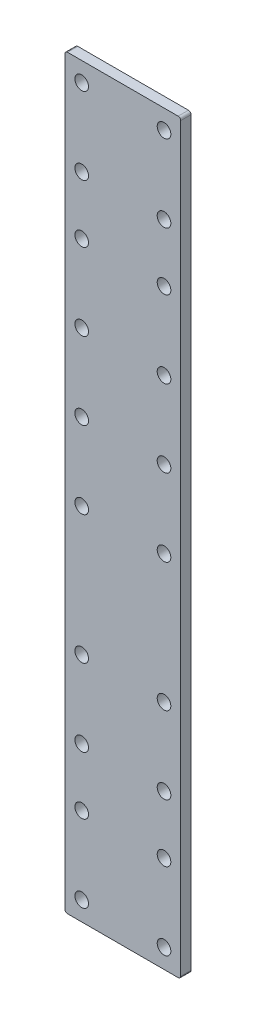
ISO-10303-21;
HEADER;
FILE_DESCRIPTION(('STEP AP214'),'2;1');
FILE_NAME('part.step','',(''),(''),'','','');
FILE_SCHEMA(('AUTOMOTIVE_DESIGN { 1 0 10303 214 1 1 1 1 }'));
ENDSEC;
DATA;
#1=APPLICATION_CONTEXT('core data for automotive mechanical design processes');
#2=APPLICATION_PROTOCOL_DEFINITION('international standard','automotive_design',2000,#1);
#3=PRODUCT_CONTEXT('',#1,'mechanical');
#4=PRODUCT('Part','Part','',(#3));
#5=PRODUCT_RELATED_PRODUCT_CATEGORY('part','',(#4));
#6=PRODUCT_DEFINITION_FORMATION('','',#4);
#7=PRODUCT_DEFINITION_CONTEXT('part definition',#1,'design');
#8=PRODUCT_DEFINITION('design','',#6,#7);
#9=PRODUCT_DEFINITION_SHAPE('','',#8);
#10=(LENGTH_UNIT() NAMED_UNIT(*) SI_UNIT(.MILLI.,.METRE.));
#11=(NAMED_UNIT(*) PLANE_ANGLE_UNIT() SI_UNIT($,.RADIAN.));
#12=(NAMED_UNIT(*) SI_UNIT($,.STERADIAN.) SOLID_ANGLE_UNIT());
#13=UNCERTAINTY_MEASURE_WITH_UNIT(LENGTH_MEASURE(1.E-05),#10,'distance_accuracy_value','');
#14=(GEOMETRIC_REPRESENTATION_CONTEXT(3) GLOBAL_UNCERTAINTY_ASSIGNED_CONTEXT((#13)) GLOBAL_UNIT_ASSIGNED_CONTEXT((#10,
#11,#12)) REPRESENTATION_CONTEXT('',''));
#15=CARTESIAN_POINT('',(0.,0.,0.));
#16=DIRECTION('',(0.,0.,1.));
#17=DIRECTION('',(1.,0.,0.));
#18=AXIS2_PLACEMENT_3D('',#15,#16,#17);
#19=CARTESIAN_POINT('',(-22.5,150.,4.));
#20=DIRECTION('',(1.,0.,0.));
#21=DIRECTION('',(0.,0.,-1.));
#22=AXIS2_PLACEMENT_3D('',#19,#20,#21);
#23=PLANE('',#22);
#24=DIRECTION('',(0.,-1.,0.));
#25=VECTOR('',#24,1.);
#26=CARTESIAN_POINT('',(-22.5,150.,0.));
#27=LINE('',#26,#25);
#28=CARTESIAN_POINT('',(-22.5,149.,0.));
#29=VERTEX_POINT('',#28);
#30=CARTESIAN_POINT('',(-22.5,-139.,0.));
#31=VERTEX_POINT('',#30);
#32=EDGE_CURVE('E126',#29,#31,#27,.T.);
#33=ORIENTED_EDGE('',*,*,#32,.T.);
#34=DIRECTION('',(0.,0.,-1.));
#35=VECTOR('',#34,1.);
#36=CARTESIAN_POINT('',(-22.5,-139.,4.));
#37=LINE('',#36,#35);
#38=CARTESIAN_POINT('',(-22.5,-139.,4.));
#39=VERTEX_POINT('',#38);
#40=EDGE_CURVE('E104',#31,#39,#37,.F.);
#41=ORIENTED_EDGE('',*,*,#40,.T.);
#42=DIRECTION('',(0.,-1.,0.));
#43=VECTOR('',#42,1.);
#44=CARTESIAN_POINT('',(-22.5,150.,4.));
#45=LINE('',#44,#43);
#46=CARTESIAN_POINT('',(-22.5,149.,4.));
#47=VERTEX_POINT('',#46);
#48=EDGE_CURVE('E136',#47,#39,#45,.T.);
#49=ORIENTED_EDGE('',*,*,#48,.F.);
#50=DIRECTION('',(0.,0.,-1.));
#51=VECTOR('',#50,1.);
#52=CARTESIAN_POINT('',(-22.5,149.,4.));
#53=LINE('',#52,#51);
#54=EDGE_CURVE('E109',#47,#29,#53,.T.);
#55=ORIENTED_EDGE('',*,*,#54,.T.);
#56=EDGE_LOOP('',(#33,#41,#49,#55));
#57=FACE_BOUND('',#56,.T.);
#58=ADVANCED_FACE('F33',(#57),#23,.F.);
#59=CARTESIAN_POINT('',(-22.5,-140.,4.));
#60=DIRECTION('',(0.,1.,0.));
#61=DIRECTION('',(0.,0.,1.));
#62=AXIS2_PLACEMENT_3D('',#59,#60,#61);
#63=PLANE('',#62);
#64=DIRECTION('',(1.,0.,0.));
#65=VECTOR('',#64,1.);
#66=CARTESIAN_POINT('',(-22.5,-140.,4.));
#67=LINE('',#66,#65);
#68=CARTESIAN_POINT('',(-21.5,-140.,4.));
#69=VERTEX_POINT('',#68);
#70=CARTESIAN_POINT('',(21.5,-140.,4.));
#71=VERTEX_POINT('',#70);
#72=EDGE_CURVE('E119',#69,#71,#67,.T.);
#73=ORIENTED_EDGE('',*,*,#72,.F.);
#74=DIRECTION('',(0.,0.,-1.));
#75=VECTOR('',#74,1.);
#76=CARTESIAN_POINT('',(-21.5,-140.,4.));
#77=LINE('',#76,#75);
#78=CARTESIAN_POINT('',(-21.5,-140.,0.));
#79=VERTEX_POINT('',#78);
#80=EDGE_CURVE('E103',#69,#79,#77,.T.);
#81=ORIENTED_EDGE('',*,*,#80,.T.);
#82=DIRECTION('',(1.,0.,0.));
#83=VECTOR('',#82,1.);
#84=CARTESIAN_POINT('',(-22.5,-140.,0.));
#85=LINE('',#84,#83);
#86=CARTESIAN_POINT('',(21.5,-140.,0.));
#87=VERTEX_POINT('',#86);
#88=EDGE_CURVE('E116',#79,#87,#85,.T.);
#89=ORIENTED_EDGE('',*,*,#88,.T.);
#90=DIRECTION('',(0.,0.,-1.));
#91=VECTOR('',#90,1.);
#92=CARTESIAN_POINT('',(21.5,-140.,4.));
#93=LINE('',#92,#91);
#94=EDGE_CURVE('E121',#87,#71,#93,.F.);
#95=ORIENTED_EDGE('',*,*,#94,.T.);
#96=EDGE_LOOP('',(#73,#81,#89,#95));
#97=FACE_BOUND('',#96,.T.);
#98=ADVANCED_FACE('F115',(#97),#63,.F.);
#99=CARTESIAN_POINT('',(22.5,150.,4.));
#100=DIRECTION('',(-1.,0.,0.));
#101=DIRECTION('',(0.,0.,1.));
#102=AXIS2_PLACEMENT_3D('',#99,#100,#101);
#103=PLANE('',#102);
#104=DIRECTION('',(0.,1.,0.));
#105=VECTOR('',#104,1.);
#106=CARTESIAN_POINT('',(22.5,150.,4.));
#107=LINE('',#106,#105);
#108=CARTESIAN_POINT('',(22.5,-139.,4.));
#109=VERTEX_POINT('',#108);
#110=CARTESIAN_POINT('',(22.5,149.,4.));
#111=VERTEX_POINT('',#110);
#112=EDGE_CURVE('E162',#109,#111,#107,.T.);
#113=ORIENTED_EDGE('',*,*,#112,.F.);
#114=DIRECTION('',(0.,0.,-1.));
#115=VECTOR('',#114,1.);
#116=CARTESIAN_POINT('',(22.5,-139.,4.));
#117=LINE('',#116,#115);
#118=CARTESIAN_POINT('',(22.5,-139.,0.));
#119=VERTEX_POINT('',#118);
#120=EDGE_CURVE('E155',#109,#119,#117,.T.);
#121=ORIENTED_EDGE('',*,*,#120,.T.);
#122=DIRECTION('',(0.,1.,0.));
#123=VECTOR('',#122,1.);
#124=CARTESIAN_POINT('',(22.5,150.,0.));
#125=LINE('',#124,#123);
#126=CARTESIAN_POINT('',(22.5,149.,0.));
#127=VERTEX_POINT('',#126);
#128=EDGE_CURVE('E125',#119,#127,#125,.T.);
#129=ORIENTED_EDGE('',*,*,#128,.T.);
#130=DIRECTION('',(0.,0.,-1.));
#131=VECTOR('',#130,1.);
#132=CARTESIAN_POINT('',(22.5,149.,4.));
#133=LINE('',#132,#131);
#134=EDGE_CURVE('E153',#127,#111,#133,.F.);
#135=ORIENTED_EDGE('',*,*,#134,.T.);
#136=EDGE_LOOP('',(#113,#121,#129,#135));
#137=FACE_BOUND('',#136,.T.);
#138=ADVANCED_FACE('F160',(#137),#103,.F.);
#139=CARTESIAN_POINT('',(22.5,150.,4.));
#140=DIRECTION('',(0.,-1.,0.));
#141=DIRECTION('',(1.,0.,0.));
#142=AXIS2_PLACEMENT_3D('',#139,#140,#141);
#143=PLANE('',#142);
#144=DIRECTION('',(-1.,0.,0.));
#145=VECTOR('',#144,1.);
#146=CARTESIAN_POINT('',(22.5,150.,4.));
#147=LINE('',#146,#145);
#148=CARTESIAN_POINT('',(21.5,150.,4.));
#149=VERTEX_POINT('',#148);
#150=CARTESIAN_POINT('',(-21.5,150.,4.));
#151=VERTEX_POINT('',#150);
#152=EDGE_CURVE('E137',#149,#151,#147,.T.);
#153=ORIENTED_EDGE('',*,*,#152,.F.);
#154=DIRECTION('',(0.,0.,-1.));
#155=VECTOR('',#154,1.);
#156=CARTESIAN_POINT('',(21.5,150.,4.));
#157=LINE('',#156,#155);
#158=CARTESIAN_POINT('',(21.5,150.,0.));
#159=VERTEX_POINT('',#158);
#160=EDGE_CURVE('E11',#149,#159,#157,.T.);
#161=ORIENTED_EDGE('',*,*,#160,.T.);
#162=DIRECTION('',(-1.,0.,0.));
#163=VECTOR('',#162,1.);
#164=CARTESIAN_POINT('',(22.5,150.,0.));
#165=LINE('',#164,#163);
#166=CARTESIAN_POINT('',(-21.5,150.,0.));
#167=VERTEX_POINT('',#166);
#168=EDGE_CURVE('E129',#159,#167,#165,.T.);
#169=ORIENTED_EDGE('',*,*,#168,.T.);
#170=DIRECTION('',(0.,0.,-1.));
#171=VECTOR('',#170,1.);
#172=CARTESIAN_POINT('',(-21.5,150.,4.));
#173=LINE('',#172,#171);
#174=EDGE_CURVE('E41',#167,#151,#173,.F.);
#175=ORIENTED_EDGE('',*,*,#174,.T.);
#176=EDGE_LOOP('',(#153,#161,#169,#175));
#177=FACE_BOUND('',#176,.T.);
#178=ADVANCED_FACE('F169',(#177),#143,.F.);
#179=CARTESIAN_POINT('',(0.,0.,4.));
#180=DIRECTION('',(0.,0.,1.));
#181=DIRECTION('',(1.,0.,0.));
#182=AXIS2_PLACEMENT_3D('',#179,#180,#181);
#183=PLANE('',#182);
#184=CARTESIAN_POINT('',(-16.,142.5,4.));
#185=DIRECTION('',(0.,0.,1.));
#186=DIRECTION('',(1.,0.,0.));
#187=AXIS2_PLACEMENT_3D('',#184,#185,#186);
#188=CIRCLE('',#187,2.65);
#189=CARTESIAN_POINT('',(-13.35,142.5,4.));
#190=VERTEX_POINT('',#189);
#191=EDGE_CURVE('E292',#190,#190,#188,.T.);
#192=ORIENTED_EDGE('',*,*,#191,.F.);
#193=EDGE_LOOP('',(#192));
#194=FACE_BOUND('',#193,.T.);
#195=CARTESIAN_POINT('',(-16.,112.5,4.));
#196=DIRECTION('',(0.,0.,1.));
#197=DIRECTION('',(1.,0.,0.));
#198=AXIS2_PLACEMENT_3D('',#195,#196,#197);
#199=CIRCLE('',#198,2.65);
#200=CARTESIAN_POINT('',(-13.35,112.5,4.));
#201=VERTEX_POINT('',#200);
#202=EDGE_CURVE('E286',#201,#201,#199,.T.);
#203=ORIENTED_EDGE('',*,*,#202,.F.);
#204=EDGE_LOOP('',(#203));
#205=FACE_BOUND('',#204,.T.);
#206=CARTESIAN_POINT('',(-16.,-102.5,4.));
#207=DIRECTION('',(0.,0.,1.));
#208=DIRECTION('',(1.,0.,0.));
#209=AXIS2_PLACEMENT_3D('',#206,#207,#208);
#210=CIRCLE('',#209,2.65);
#211=CARTESIAN_POINT('',(-13.35,-102.5,4.));
#212=VERTEX_POINT('',#211);
#213=EDGE_CURVE('E280',#212,#212,#210,.T.);
#214=ORIENTED_EDGE('',*,*,#213,.F.);
#215=EDGE_LOOP('',(#214));
#216=FACE_BOUND('',#215,.T.);
#217=CARTESIAN_POINT('',(-16.,-132.5,4.));
#218=DIRECTION('',(0.,0.,1.));
#219=DIRECTION('',(1.,0.,0.));
#220=AXIS2_PLACEMENT_3D('',#217,#218,#219);
#221=CIRCLE('',#220,2.65);
#222=CARTESIAN_POINT('',(-13.35,-132.5,4.));
#223=VERTEX_POINT('',#222);
#224=EDGE_CURVE('E274',#223,#223,#221,.T.);
#225=ORIENTED_EDGE('',*,*,#224,.F.);
#226=EDGE_LOOP('',(#225));
#227=FACE_BOUND('',#226,.T.);
#228=CARTESIAN_POINT('',(16.,-132.5,4.));
#229=DIRECTION('',(0.,0.,1.));
#230=DIRECTION('',(1.,0.,0.));
#231=AXIS2_PLACEMENT_3D('',#228,#229,#230);
#232=CIRCLE('',#231,2.65);
#233=CARTESIAN_POINT('',(18.65,-132.5,4.));
#234=VERTEX_POINT('',#233);
#235=EDGE_CURVE('E268',#234,#234,#232,.T.);
#236=ORIENTED_EDGE('',*,*,#235,.F.);
#237=EDGE_LOOP('',(#236));
#238=FACE_BOUND('',#237,.T.);
#239=CARTESIAN_POINT('',(16.,-102.5,4.));
#240=DIRECTION('',(0.,0.,1.));
#241=DIRECTION('',(1.,0.,0.));
#242=AXIS2_PLACEMENT_3D('',#239,#240,#241);
#243=CIRCLE('',#242,2.65);
#244=CARTESIAN_POINT('',(18.65,-102.5,4.));
#245=VERTEX_POINT('',#244);
#246=EDGE_CURVE('E262',#245,#245,#243,.T.);
#247=ORIENTED_EDGE('',*,*,#246,.F.);
#248=EDGE_LOOP('',(#247));
#249=FACE_BOUND('',#248,.T.);
#250=CARTESIAN_POINT('',(16.,112.5,4.));
#251=DIRECTION('',(0.,0.,1.));
#252=DIRECTION('',(1.,0.,0.));
#253=AXIS2_PLACEMENT_3D('',#250,#251,#252);
#254=CIRCLE('',#253,2.65);
#255=CARTESIAN_POINT('',(18.65,112.5,4.));
#256=VERTEX_POINT('',#255);
#257=EDGE_CURVE('E256',#256,#256,#254,.T.);
#258=ORIENTED_EDGE('',*,*,#257,.F.);
#259=EDGE_LOOP('',(#258));
#260=FACE_BOUND('',#259,.T.);
#261=CARTESIAN_POINT('',(16.,142.5,4.));
#262=DIRECTION('',(0.,0.,1.));
#263=DIRECTION('',(1.,0.,0.));
#264=AXIS2_PLACEMENT_3D('',#261,#262,#263);
#265=CIRCLE('',#264,2.65);
#266=CARTESIAN_POINT('',(18.65,142.5,4.));
#267=VERTEX_POINT('',#266);
#268=EDGE_CURVE('E250',#267,#267,#265,.T.);
#269=ORIENTED_EDGE('',*,*,#268,.F.);
#270=EDGE_LOOP('',(#269));
#271=FACE_BOUND('',#270,.T.);
#272=CARTESIAN_POINT('',(-16.,30.,4.));
#273=DIRECTION('',(0.,0.,1.));
#274=DIRECTION('',(1.,0.,0.));
#275=AXIS2_PLACEMENT_3D('',#272,#273,#274);
#276=CIRCLE('',#275,2.65);
#277=CARTESIAN_POINT('',(-13.35,30.,4.));
#278=VERTEX_POINT('',#277);
#279=EDGE_CURVE('E244',#278,#278,#276,.T.);
#280=ORIENTED_EDGE('',*,*,#279,.F.);
#281=EDGE_LOOP('',(#280));
#282=FACE_BOUND('',#281,.T.);
#283=CARTESIAN_POINT('',(-16.,0.,4.));
#284=DIRECTION('',(0.,0.,1.));
#285=DIRECTION('',(1.,0.,0.));
#286=AXIS2_PLACEMENT_3D('',#283,#284,#285);
#287=CIRCLE('',#286,2.65);
#288=CARTESIAN_POINT('',(-13.35,0.,4.));
#289=VERTEX_POINT('',#288);
#290=EDGE_CURVE('E238',#289,#289,#287,.T.);
#291=ORIENTED_EDGE('',*,*,#290,.F.);
#292=EDGE_LOOP('',(#291));
#293=FACE_BOUND('',#292,.T.);
#294=CARTESIAN_POINT('',(16.,0.,4.));
#295=DIRECTION('',(0.,0.,1.));
#296=DIRECTION('',(1.,0.,0.));
#297=AXIS2_PLACEMENT_3D('',#294,#295,#296);
#298=CIRCLE('',#297,2.65);
#299=CARTESIAN_POINT('',(18.65,0.,4.));
#300=VERTEX_POINT('',#299);
#301=EDGE_CURVE('E232',#300,#300,#298,.T.);
#302=ORIENTED_EDGE('',*,*,#301,.F.);
#303=EDGE_LOOP('',(#302));
#304=FACE_BOUND('',#303,.T.);
#305=CARTESIAN_POINT('',(16.,30.,4.));
#306=DIRECTION('',(0.,0.,1.));
#307=DIRECTION('',(1.,0.,0.));
#308=AXIS2_PLACEMENT_3D('',#305,#306,#307);
#309=CIRCLE('',#308,2.65);
#310=CARTESIAN_POINT('',(18.65,30.,4.));
#311=VERTEX_POINT('',#310);
#312=EDGE_CURVE('E226',#311,#311,#309,.T.);
#313=ORIENTED_EDGE('',*,*,#312,.F.);
#314=EDGE_LOOP('',(#313));
#315=FACE_BOUND('',#314,.T.);
#316=CARTESIAN_POINT('',(-16.,90.,4.));
#317=DIRECTION('',(0.,0.,1.));
#318=DIRECTION('',(1.,0.,0.));
#319=AXIS2_PLACEMENT_3D('',#316,#317,#318);
#320=CIRCLE('',#319,2.65);
#321=CARTESIAN_POINT('',(-13.35,90.,4.));
#322=VERTEX_POINT('',#321);
#323=EDGE_CURVE('E220',#322,#322,#320,.T.);
#324=ORIENTED_EDGE('',*,*,#323,.F.);
#325=EDGE_LOOP('',(#324));
#326=FACE_BOUND('',#325,.T.);
#327=CARTESIAN_POINT('',(-16.,60.,4.));
#328=DIRECTION('',(0.,0.,1.));
#329=DIRECTION('',(1.,0.,0.));
#330=AXIS2_PLACEMENT_3D('',#327,#328,#329);
#331=CIRCLE('',#330,2.65);
#332=CARTESIAN_POINT('',(-13.35,60.,4.));
#333=VERTEX_POINT('',#332);
#334=EDGE_CURVE('E214',#333,#333,#331,.T.);
#335=ORIENTED_EDGE('',*,*,#334,.F.);
#336=EDGE_LOOP('',(#335));
#337=FACE_BOUND('',#336,.T.);
#338=CARTESIAN_POINT('',(-16.,-50.,4.));
#339=DIRECTION('',(0.,0.,1.));
#340=DIRECTION('',(1.,0.,0.));
#341=AXIS2_PLACEMENT_3D('',#338,#339,#340);
#342=CIRCLE('',#341,2.65);
#343=CARTESIAN_POINT('',(-13.35,-50.,4.));
#344=VERTEX_POINT('',#343);
#345=EDGE_CURVE('E208',#344,#344,#342,.T.);
#346=ORIENTED_EDGE('',*,*,#345,.F.);
#347=EDGE_LOOP('',(#346));
#348=FACE_BOUND('',#347,.T.);
#349=CARTESIAN_POINT('',(-16.,-80.,4.));
#350=DIRECTION('',(0.,0.,1.));
#351=DIRECTION('',(1.,0.,0.));
#352=AXIS2_PLACEMENT_3D('',#349,#350,#351);
#353=CIRCLE('',#352,2.65);
#354=CARTESIAN_POINT('',(-13.35,-80.,4.));
#355=VERTEX_POINT('',#354);
#356=EDGE_CURVE('E202',#355,#355,#353,.T.);
#357=ORIENTED_EDGE('',*,*,#356,.F.);
#358=EDGE_LOOP('',(#357));
#359=FACE_BOUND('',#358,.T.);
#360=CARTESIAN_POINT('',(16.,-80.,4.));
#361=DIRECTION('',(0.,0.,1.));
#362=DIRECTION('',(1.,0.,0.));
#363=AXIS2_PLACEMENT_3D('',#360,#361,#362);
#364=CIRCLE('',#363,2.65);
#365=CARTESIAN_POINT('',(18.65,-80.,4.));
#366=VERTEX_POINT('',#365);
#367=EDGE_CURVE('E196',#366,#366,#364,.T.);
#368=ORIENTED_EDGE('',*,*,#367,.F.);
#369=EDGE_LOOP('',(#368));
#370=FACE_BOUND('',#369,.T.);
#371=CARTESIAN_POINT('',(16.,-50.,4.));
#372=DIRECTION('',(0.,0.,1.));
#373=DIRECTION('',(1.,0.,0.));
#374=AXIS2_PLACEMENT_3D('',#371,#372,#373);
#375=CIRCLE('',#374,2.65);
#376=CARTESIAN_POINT('',(18.65,-50.,4.));
#377=VERTEX_POINT('',#376);
#378=EDGE_CURVE('E190',#377,#377,#375,.T.);
#379=ORIENTED_EDGE('',*,*,#378,.F.);
#380=EDGE_LOOP('',(#379));
#381=FACE_BOUND('',#380,.T.);
#382=CARTESIAN_POINT('',(16.,60.,4.));
#383=DIRECTION('',(0.,0.,1.));
#384=DIRECTION('',(1.,0.,0.));
#385=AXIS2_PLACEMENT_3D('',#382,#383,#384);
#386=CIRCLE('',#385,2.65);
#387=CARTESIAN_POINT('',(18.65,60.,4.));
#388=VERTEX_POINT('',#387);
#389=EDGE_CURVE('E184',#388,#388,#386,.T.);
#390=ORIENTED_EDGE('',*,*,#389,.F.);
#391=EDGE_LOOP('',(#390));
#392=FACE_BOUND('',#391,.T.);
#393=CARTESIAN_POINT('',(16.,90.,4.));
#394=DIRECTION('',(0.,0.,1.));
#395=DIRECTION('',(1.,0.,0.));
#396=AXIS2_PLACEMENT_3D('',#393,#394,#395);
#397=CIRCLE('',#396,2.65);
#398=CARTESIAN_POINT('',(18.65,90.,4.));
#399=VERTEX_POINT('',#398);
#400=EDGE_CURVE('E178',#399,#399,#397,.T.);
#401=ORIENTED_EDGE('',*,*,#400,.F.);
#402=EDGE_LOOP('',(#401));
#403=FACE_BOUND('',#402,.T.);
#404=ORIENTED_EDGE('',*,*,#48,.T.);
#405=CARTESIAN_POINT('',(-21.5,-139.,4.));
#406=DIRECTION('',(0.,0.,1.));
#407=DIRECTION('',(1.,0.,0.));
#408=AXIS2_PLACEMENT_3D('',#405,#406,#407);
#409=CIRCLE('',#408,1.);
#410=EDGE_CURVE('E151',#39,#69,#409,.T.);
#411=ORIENTED_EDGE('',*,*,#410,.T.);
#412=ORIENTED_EDGE('',*,*,#72,.T.);
#413=CARTESIAN_POINT('',(21.5,-139.,4.));
#414=DIRECTION('',(0.,0.,1.));
#415=DIRECTION('',(1.,0.,0.));
#416=AXIS2_PLACEMENT_3D('',#413,#414,#415);
#417=CIRCLE('',#416,1.);
#418=EDGE_CURVE('E149',#71,#109,#417,.T.);
#419=ORIENTED_EDGE('',*,*,#418,.T.);
#420=ORIENTED_EDGE('',*,*,#112,.T.);
#421=CARTESIAN_POINT('',(21.5,149.,4.));
#422=DIRECTION('',(0.,0.,1.));
#423=DIRECTION('',(1.,0.,0.));
#424=AXIS2_PLACEMENT_3D('',#421,#422,#423);
#425=CIRCLE('',#424,1.);
#426=EDGE_CURVE('E54',#111,#149,#425,.T.);
#427=ORIENTED_EDGE('',*,*,#426,.T.);
#428=ORIENTED_EDGE('',*,*,#152,.T.);
#429=CARTESIAN_POINT('',(-21.5,149.,4.));
#430=DIRECTION('',(0.,0.,1.));
#431=DIRECTION('',(1.,0.,0.));
#432=AXIS2_PLACEMENT_3D('',#429,#430,#431);
#433=CIRCLE('',#432,1.);
#434=EDGE_CURVE('E146',#151,#47,#433,.T.);
#435=ORIENTED_EDGE('',*,*,#434,.T.);
#436=EDGE_LOOP('',(#404,#411,#412,#419,#420,#427,#428,#435));
#437=FACE_BOUND('',#436,.T.);
#438=ADVANCED_FACE('F298',(#194,#205,#216,#227,#238,#249,#260,#271,#282,#293,#304,#315,#326,
#337,#348,#359,#370,#381,#392,#403,#437),#183,.T.);
#439=CARTESIAN_POINT('',(0.,0.,0.));
#440=DIRECTION('',(0.,0.,1.));
#441=DIRECTION('',(1.,0.,0.));
#442=AXIS2_PLACEMENT_3D('',#439,#440,#441);
#443=PLANE('',#442);
#444=CARTESIAN_POINT('',(-16.,142.5,0.));
#445=DIRECTION('',(0.,0.,1.));
#446=DIRECTION('',(1.,0.,0.));
#447=AXIS2_PLACEMENT_3D('',#444,#445,#446);
#448=CIRCLE('',#447,2.65);
#449=CARTESIAN_POINT('',(-13.35,142.5,0.));
#450=VERTEX_POINT('',#449);
#451=EDGE_CURVE('E289',#450,#450,#448,.T.);
#452=ORIENTED_EDGE('',*,*,#451,.T.);
#453=EDGE_LOOP('',(#452));
#454=FACE_BOUND('',#453,.T.);
#455=CARTESIAN_POINT('',(-16.,112.5,0.));
#456=DIRECTION('',(0.,0.,1.));
#457=DIRECTION('',(1.,0.,0.));
#458=AXIS2_PLACEMENT_3D('',#455,#456,#457);
#459=CIRCLE('',#458,2.65);
#460=CARTESIAN_POINT('',(-13.35,112.5,0.));
#461=VERTEX_POINT('',#460);
#462=EDGE_CURVE('E283',#461,#461,#459,.T.);
#463=ORIENTED_EDGE('',*,*,#462,.T.);
#464=EDGE_LOOP('',(#463));
#465=FACE_BOUND('',#464,.T.);
#466=CARTESIAN_POINT('',(-16.,-102.5,0.));
#467=DIRECTION('',(0.,0.,1.));
#468=DIRECTION('',(1.,0.,0.));
#469=AXIS2_PLACEMENT_3D('',#466,#467,#468);
#470=CIRCLE('',#469,2.65);
#471=CARTESIAN_POINT('',(-13.35,-102.5,0.));
#472=VERTEX_POINT('',#471);
#473=EDGE_CURVE('E277',#472,#472,#470,.T.);
#474=ORIENTED_EDGE('',*,*,#473,.T.);
#475=EDGE_LOOP('',(#474));
#476=FACE_BOUND('',#475,.T.);
#477=CARTESIAN_POINT('',(-16.,-132.5,0.));
#478=DIRECTION('',(0.,0.,1.));
#479=DIRECTION('',(1.,0.,0.));
#480=AXIS2_PLACEMENT_3D('',#477,#478,#479);
#481=CIRCLE('',#480,2.65);
#482=CARTESIAN_POINT('',(-13.35,-132.5,0.));
#483=VERTEX_POINT('',#482);
#484=EDGE_CURVE('E271',#483,#483,#481,.T.);
#485=ORIENTED_EDGE('',*,*,#484,.T.);
#486=EDGE_LOOP('',(#485));
#487=FACE_BOUND('',#486,.T.);
#488=CARTESIAN_POINT('',(16.,-132.5,0.));
#489=DIRECTION('',(0.,0.,1.));
#490=DIRECTION('',(1.,0.,0.));
#491=AXIS2_PLACEMENT_3D('',#488,#489,#490);
#492=CIRCLE('',#491,2.65);
#493=CARTESIAN_POINT('',(18.65,-132.5,0.));
#494=VERTEX_POINT('',#493);
#495=EDGE_CURVE('E265',#494,#494,#492,.T.);
#496=ORIENTED_EDGE('',*,*,#495,.T.);
#497=EDGE_LOOP('',(#496));
#498=FACE_BOUND('',#497,.T.);
#499=CARTESIAN_POINT('',(16.,-102.5,0.));
#500=DIRECTION('',(0.,0.,1.));
#501=DIRECTION('',(1.,0.,0.));
#502=AXIS2_PLACEMENT_3D('',#499,#500,#501);
#503=CIRCLE('',#502,2.65);
#504=CARTESIAN_POINT('',(18.65,-102.5,0.));
#505=VERTEX_POINT('',#504);
#506=EDGE_CURVE('E259',#505,#505,#503,.T.);
#507=ORIENTED_EDGE('',*,*,#506,.T.);
#508=EDGE_LOOP('',(#507));
#509=FACE_BOUND('',#508,.T.);
#510=CARTESIAN_POINT('',(16.,112.5,0.));
#511=DIRECTION('',(0.,0.,1.));
#512=DIRECTION('',(1.,0.,0.));
#513=AXIS2_PLACEMENT_3D('',#510,#511,#512);
#514=CIRCLE('',#513,2.65);
#515=CARTESIAN_POINT('',(18.65,112.5,0.));
#516=VERTEX_POINT('',#515);
#517=EDGE_CURVE('E253',#516,#516,#514,.T.);
#518=ORIENTED_EDGE('',*,*,#517,.T.);
#519=EDGE_LOOP('',(#518));
#520=FACE_BOUND('',#519,.T.);
#521=CARTESIAN_POINT('',(16.,142.5,0.));
#522=DIRECTION('',(0.,0.,1.));
#523=DIRECTION('',(1.,0.,0.));
#524=AXIS2_PLACEMENT_3D('',#521,#522,#523);
#525=CIRCLE('',#524,2.65);
#526=CARTESIAN_POINT('',(18.65,142.5,0.));
#527=VERTEX_POINT('',#526);
#528=EDGE_CURVE('E247',#527,#527,#525,.T.);
#529=ORIENTED_EDGE('',*,*,#528,.T.);
#530=EDGE_LOOP('',(#529));
#531=FACE_BOUND('',#530,.T.);
#532=CARTESIAN_POINT('',(-16.,30.,0.));
#533=DIRECTION('',(0.,0.,1.));
#534=DIRECTION('',(1.,0.,0.));
#535=AXIS2_PLACEMENT_3D('',#532,#533,#534);
#536=CIRCLE('',#535,2.65);
#537=CARTESIAN_POINT('',(-13.35,30.,0.));
#538=VERTEX_POINT('',#537);
#539=EDGE_CURVE('E241',#538,#538,#536,.T.);
#540=ORIENTED_EDGE('',*,*,#539,.T.);
#541=EDGE_LOOP('',(#540));
#542=FACE_BOUND('',#541,.T.);
#543=CARTESIAN_POINT('',(-16.,0.,0.));
#544=DIRECTION('',(0.,0.,1.));
#545=DIRECTION('',(1.,0.,0.));
#546=AXIS2_PLACEMENT_3D('',#543,#544,#545);
#547=CIRCLE('',#546,2.65);
#548=CARTESIAN_POINT('',(-13.35,0.,0.));
#549=VERTEX_POINT('',#548);
#550=EDGE_CURVE('E235',#549,#549,#547,.T.);
#551=ORIENTED_EDGE('',*,*,#550,.T.);
#552=EDGE_LOOP('',(#551));
#553=FACE_BOUND('',#552,.T.);
#554=CARTESIAN_POINT('',(16.,0.,0.));
#555=DIRECTION('',(0.,0.,1.));
#556=DIRECTION('',(1.,0.,0.));
#557=AXIS2_PLACEMENT_3D('',#554,#555,#556);
#558=CIRCLE('',#557,2.65);
#559=CARTESIAN_POINT('',(18.65,0.,0.));
#560=VERTEX_POINT('',#559);
#561=EDGE_CURVE('E229',#560,#560,#558,.T.);
#562=ORIENTED_EDGE('',*,*,#561,.T.);
#563=EDGE_LOOP('',(#562));
#564=FACE_BOUND('',#563,.T.);
#565=CARTESIAN_POINT('',(16.,30.,0.));
#566=DIRECTION('',(0.,0.,1.));
#567=DIRECTION('',(1.,0.,0.));
#568=AXIS2_PLACEMENT_3D('',#565,#566,#567);
#569=CIRCLE('',#568,2.65);
#570=CARTESIAN_POINT('',(18.65,30.,0.));
#571=VERTEX_POINT('',#570);
#572=EDGE_CURVE('E223',#571,#571,#569,.T.);
#573=ORIENTED_EDGE('',*,*,#572,.T.);
#574=EDGE_LOOP('',(#573));
#575=FACE_BOUND('',#574,.T.);
#576=CARTESIAN_POINT('',(-16.,90.,0.));
#577=DIRECTION('',(0.,0.,1.));
#578=DIRECTION('',(1.,0.,0.));
#579=AXIS2_PLACEMENT_3D('',#576,#577,#578);
#580=CIRCLE('',#579,2.65);
#581=CARTESIAN_POINT('',(-13.35,90.,0.));
#582=VERTEX_POINT('',#581);
#583=EDGE_CURVE('E217',#582,#582,#580,.T.);
#584=ORIENTED_EDGE('',*,*,#583,.T.);
#585=EDGE_LOOP('',(#584));
#586=FACE_BOUND('',#585,.T.);
#587=CARTESIAN_POINT('',(-16.,60.,0.));
#588=DIRECTION('',(0.,0.,1.));
#589=DIRECTION('',(1.,0.,0.));
#590=AXIS2_PLACEMENT_3D('',#587,#588,#589);
#591=CIRCLE('',#590,2.65);
#592=CARTESIAN_POINT('',(-13.35,60.,0.));
#593=VERTEX_POINT('',#592);
#594=EDGE_CURVE('E211',#593,#593,#591,.T.);
#595=ORIENTED_EDGE('',*,*,#594,.T.);
#596=EDGE_LOOP('',(#595));
#597=FACE_BOUND('',#596,.T.);
#598=CARTESIAN_POINT('',(-16.,-50.,0.));
#599=DIRECTION('',(0.,0.,1.));
#600=DIRECTION('',(1.,0.,0.));
#601=AXIS2_PLACEMENT_3D('',#598,#599,#600);
#602=CIRCLE('',#601,2.65);
#603=CARTESIAN_POINT('',(-13.35,-50.,0.));
#604=VERTEX_POINT('',#603);
#605=EDGE_CURVE('E205',#604,#604,#602,.T.);
#606=ORIENTED_EDGE('',*,*,#605,.T.);
#607=EDGE_LOOP('',(#606));
#608=FACE_BOUND('',#607,.T.);
#609=CARTESIAN_POINT('',(-16.,-80.,0.));
#610=DIRECTION('',(0.,0.,1.));
#611=DIRECTION('',(1.,0.,0.));
#612=AXIS2_PLACEMENT_3D('',#609,#610,#611);
#613=CIRCLE('',#612,2.65);
#614=CARTESIAN_POINT('',(-13.35,-80.,0.));
#615=VERTEX_POINT('',#614);
#616=EDGE_CURVE('E199',#615,#615,#613,.T.);
#617=ORIENTED_EDGE('',*,*,#616,.T.);
#618=EDGE_LOOP('',(#617));
#619=FACE_BOUND('',#618,.T.);
#620=CARTESIAN_POINT('',(16.,-80.,0.));
#621=DIRECTION('',(0.,0.,1.));
#622=DIRECTION('',(1.,0.,0.));
#623=AXIS2_PLACEMENT_3D('',#620,#621,#622);
#624=CIRCLE('',#623,2.65);
#625=CARTESIAN_POINT('',(18.65,-80.,0.));
#626=VERTEX_POINT('',#625);
#627=EDGE_CURVE('E193',#626,#626,#624,.T.);
#628=ORIENTED_EDGE('',*,*,#627,.T.);
#629=EDGE_LOOP('',(#628));
#630=FACE_BOUND('',#629,.T.);
#631=CARTESIAN_POINT('',(16.,-50.,0.));
#632=DIRECTION('',(0.,0.,1.));
#633=DIRECTION('',(1.,0.,0.));
#634=AXIS2_PLACEMENT_3D('',#631,#632,#633);
#635=CIRCLE('',#634,2.65);
#636=CARTESIAN_POINT('',(18.65,-50.,0.));
#637=VERTEX_POINT('',#636);
#638=EDGE_CURVE('E187',#637,#637,#635,.T.);
#639=ORIENTED_EDGE('',*,*,#638,.T.);
#640=EDGE_LOOP('',(#639));
#641=FACE_BOUND('',#640,.T.);
#642=CARTESIAN_POINT('',(16.,60.,0.));
#643=DIRECTION('',(0.,0.,1.));
#644=DIRECTION('',(1.,0.,0.));
#645=AXIS2_PLACEMENT_3D('',#642,#643,#644);
#646=CIRCLE('',#645,2.65);
#647=CARTESIAN_POINT('',(18.65,60.,0.));
#648=VERTEX_POINT('',#647);
#649=EDGE_CURVE('E181',#648,#648,#646,.T.);
#650=ORIENTED_EDGE('',*,*,#649,.T.);
#651=EDGE_LOOP('',(#650));
#652=FACE_BOUND('',#651,.T.);
#653=CARTESIAN_POINT('',(16.,90.,0.));
#654=DIRECTION('',(0.,0.,1.));
#655=DIRECTION('',(1.,0.,0.));
#656=AXIS2_PLACEMENT_3D('',#653,#654,#655);
#657=CIRCLE('',#656,2.65);
#658=CARTESIAN_POINT('',(18.65,90.,0.));
#659=VERTEX_POINT('',#658);
#660=EDGE_CURVE('E131',#659,#659,#657,.T.);
#661=ORIENTED_EDGE('',*,*,#660,.T.);
#662=EDGE_LOOP('',(#661));
#663=FACE_BOUND('',#662,.T.);
#664=ORIENTED_EDGE('',*,*,#88,.F.);
#665=CARTESIAN_POINT('',(-21.5,-139.,0.));
#666=DIRECTION('',(0.,0.,1.));
#667=DIRECTION('',(1.,0.,0.));
#668=AXIS2_PLACEMENT_3D('',#665,#666,#667);
#669=CIRCLE('',#668,1.);
#670=EDGE_CURVE('E99',#79,#31,#669,.F.);
#671=ORIENTED_EDGE('',*,*,#670,.T.);
#672=ORIENTED_EDGE('',*,*,#32,.F.);
#673=CARTESIAN_POINT('',(-21.5,149.,0.));
#674=DIRECTION('',(0.,0.,1.));
#675=DIRECTION('',(1.,0.,0.));
#676=AXIS2_PLACEMENT_3D('',#673,#674,#675);
#677=CIRCLE('',#676,1.);
#678=EDGE_CURVE('E120',#29,#167,#677,.F.);
#679=ORIENTED_EDGE('',*,*,#678,.T.);
#680=ORIENTED_EDGE('',*,*,#168,.F.);
#681=CARTESIAN_POINT('',(21.5,149.,0.));
#682=DIRECTION('',(0.,0.,1.));
#683=DIRECTION('',(1.,0.,0.));
#684=AXIS2_PLACEMENT_3D('',#681,#682,#683);
#685=CIRCLE('',#684,1.);
#686=EDGE_CURVE('E140',#159,#127,#685,.F.);
#687=ORIENTED_EDGE('',*,*,#686,.T.);
#688=ORIENTED_EDGE('',*,*,#128,.F.);
#689=CARTESIAN_POINT('',(21.5,-139.,0.));
#690=DIRECTION('',(0.,0.,1.));
#691=DIRECTION('',(1.,0.,0.));
#692=AXIS2_PLACEMENT_3D('',#689,#690,#691);
#693=CIRCLE('',#692,1.);
#694=EDGE_CURVE('E110',#119,#87,#693,.F.);
#695=ORIENTED_EDGE('',*,*,#694,.T.);
#696=EDGE_LOOP('',(#664,#671,#672,#679,#680,#687,#688,#695));
#697=FACE_BOUND('',#696,.T.);
#698=ADVANCED_FACE('F123',(#454,#465,#476,#487,#498,#509,#520,#531,#542,#553,#564,#575,#586,
#597,#608,#619,#630,#641,#652,#663,#697),#443,.F.);
#699=CARTESIAN_POINT('',(16.,90.,4.));
#700=DIRECTION('',(0.,0.,1.));
#701=DIRECTION('',(1.,0.,0.));
#702=AXIS2_PLACEMENT_3D('',#699,#700,#701);
#703=CYLINDRICAL_SURFACE('',#702,2.65);
#704=ORIENTED_EDGE('',*,*,#660,.F.);
#705=EDGE_LOOP('',(#704));
#706=FACE_BOUND('',#705,.T.);
#707=ORIENTED_EDGE('',*,*,#400,.T.);
#708=EDGE_LOOP('',(#707));
#709=FACE_BOUND('',#708,.T.);
#710=ADVANCED_FACE('F550',(#706,#709),#703,.F.);
#711=CARTESIAN_POINT('',(16.,60.,4.));
#712=DIRECTION('',(0.,0.,1.));
#713=DIRECTION('',(1.,0.,0.));
#714=AXIS2_PLACEMENT_3D('',#711,#712,#713);
#715=CYLINDRICAL_SURFACE('',#714,2.65);
#716=ORIENTED_EDGE('',*,*,#649,.F.);
#717=EDGE_LOOP('',(#716));
#718=FACE_BOUND('',#717,.T.);
#719=ORIENTED_EDGE('',*,*,#389,.T.);
#720=EDGE_LOOP('',(#719));
#721=FACE_BOUND('',#720,.T.);
#722=ADVANCED_FACE('F541',(#718,#721),#715,.F.);
#723=CARTESIAN_POINT('',(16.,-50.,4.));
#724=DIRECTION('',(0.,0.,1.));
#725=DIRECTION('',(1.,0.,0.));
#726=AXIS2_PLACEMENT_3D('',#723,#724,#725);
#727=CYLINDRICAL_SURFACE('',#726,2.65);
#728=ORIENTED_EDGE('',*,*,#638,.F.);
#729=EDGE_LOOP('',(#728));
#730=FACE_BOUND('',#729,.T.);
#731=ORIENTED_EDGE('',*,*,#378,.T.);
#732=EDGE_LOOP('',(#731));
#733=FACE_BOUND('',#732,.T.);
#734=ADVANCED_FACE('F532',(#730,#733),#727,.F.);
#735=CARTESIAN_POINT('',(16.,-80.,4.));
#736=DIRECTION('',(0.,0.,1.));
#737=DIRECTION('',(1.,0.,0.));
#738=AXIS2_PLACEMENT_3D('',#735,#736,#737);
#739=CYLINDRICAL_SURFACE('',#738,2.65);
#740=ORIENTED_EDGE('',*,*,#627,.F.);
#741=EDGE_LOOP('',(#740));
#742=FACE_BOUND('',#741,.T.);
#743=ORIENTED_EDGE('',*,*,#367,.T.);
#744=EDGE_LOOP('',(#743));
#745=FACE_BOUND('',#744,.T.);
#746=ADVANCED_FACE('F523',(#742,#745),#739,.F.);
#747=CARTESIAN_POINT('',(-16.,-80.,4.));
#748=DIRECTION('',(0.,0.,1.));
#749=DIRECTION('',(1.,0.,0.));
#750=AXIS2_PLACEMENT_3D('',#747,#748,#749);
#751=CYLINDRICAL_SURFACE('',#750,2.65);
#752=ORIENTED_EDGE('',*,*,#616,.F.);
#753=EDGE_LOOP('',(#752));
#754=FACE_BOUND('',#753,.T.);
#755=ORIENTED_EDGE('',*,*,#356,.T.);
#756=EDGE_LOOP('',(#755));
#757=FACE_BOUND('',#756,.T.);
#758=ADVANCED_FACE('F514',(#754,#757),#751,.F.);
#759=CARTESIAN_POINT('',(-16.,-50.,4.));
#760=DIRECTION('',(0.,0.,1.));
#761=DIRECTION('',(1.,0.,0.));
#762=AXIS2_PLACEMENT_3D('',#759,#760,#761);
#763=CYLINDRICAL_SURFACE('',#762,2.65);
#764=ORIENTED_EDGE('',*,*,#605,.F.);
#765=EDGE_LOOP('',(#764));
#766=FACE_BOUND('',#765,.T.);
#767=ORIENTED_EDGE('',*,*,#345,.T.);
#768=EDGE_LOOP('',(#767));
#769=FACE_BOUND('',#768,.T.);
#770=ADVANCED_FACE('F505',(#766,#769),#763,.F.);
#771=CARTESIAN_POINT('',(-16.,60.,4.));
#772=DIRECTION('',(0.,0.,1.));
#773=DIRECTION('',(1.,0.,0.));
#774=AXIS2_PLACEMENT_3D('',#771,#772,#773);
#775=CYLINDRICAL_SURFACE('',#774,2.65);
#776=ORIENTED_EDGE('',*,*,#594,.F.);
#777=EDGE_LOOP('',(#776));
#778=FACE_BOUND('',#777,.T.);
#779=ORIENTED_EDGE('',*,*,#334,.T.);
#780=EDGE_LOOP('',(#779));
#781=FACE_BOUND('',#780,.T.);
#782=ADVANCED_FACE('F496',(#778,#781),#775,.F.);
#783=CARTESIAN_POINT('',(-16.,90.,4.));
#784=DIRECTION('',(0.,0.,1.));
#785=DIRECTION('',(1.,0.,0.));
#786=AXIS2_PLACEMENT_3D('',#783,#784,#785);
#787=CYLINDRICAL_SURFACE('',#786,2.65);
#788=ORIENTED_EDGE('',*,*,#583,.F.);
#789=EDGE_LOOP('',(#788));
#790=FACE_BOUND('',#789,.T.);
#791=ORIENTED_EDGE('',*,*,#323,.T.);
#792=EDGE_LOOP('',(#791));
#793=FACE_BOUND('',#792,.T.);
#794=ADVANCED_FACE('F487',(#790,#793),#787,.F.);
#795=CARTESIAN_POINT('',(16.,30.,4.));
#796=DIRECTION('',(0.,0.,1.));
#797=DIRECTION('',(1.,0.,0.));
#798=AXIS2_PLACEMENT_3D('',#795,#796,#797);
#799=CYLINDRICAL_SURFACE('',#798,2.65);
#800=ORIENTED_EDGE('',*,*,#572,.F.);
#801=EDGE_LOOP('',(#800));
#802=FACE_BOUND('',#801,.T.);
#803=ORIENTED_EDGE('',*,*,#312,.T.);
#804=EDGE_LOOP('',(#803));
#805=FACE_BOUND('',#804,.T.);
#806=ADVANCED_FACE('F478',(#802,#805),#799,.F.);
#807=CARTESIAN_POINT('',(16.,0.,4.));
#808=DIRECTION('',(0.,0.,1.));
#809=DIRECTION('',(1.,0.,0.));
#810=AXIS2_PLACEMENT_3D('',#807,#808,#809);
#811=CYLINDRICAL_SURFACE('',#810,2.65);
#812=ORIENTED_EDGE('',*,*,#561,.F.);
#813=EDGE_LOOP('',(#812));
#814=FACE_BOUND('',#813,.T.);
#815=ORIENTED_EDGE('',*,*,#301,.T.);
#816=EDGE_LOOP('',(#815));
#817=FACE_BOUND('',#816,.T.);
#818=ADVANCED_FACE('F469',(#814,#817),#811,.F.);
#819=CARTESIAN_POINT('',(-16.,0.,4.));
#820=DIRECTION('',(0.,0.,1.));
#821=DIRECTION('',(1.,0.,0.));
#822=AXIS2_PLACEMENT_3D('',#819,#820,#821);
#823=CYLINDRICAL_SURFACE('',#822,2.65);
#824=ORIENTED_EDGE('',*,*,#550,.F.);
#825=EDGE_LOOP('',(#824));
#826=FACE_BOUND('',#825,.T.);
#827=ORIENTED_EDGE('',*,*,#290,.T.);
#828=EDGE_LOOP('',(#827));
#829=FACE_BOUND('',#828,.T.);
#830=ADVANCED_FACE('F460',(#826,#829),#823,.F.);
#831=CARTESIAN_POINT('',(-16.,30.,4.));
#832=DIRECTION('',(0.,0.,1.));
#833=DIRECTION('',(1.,0.,0.));
#834=AXIS2_PLACEMENT_3D('',#831,#832,#833);
#835=CYLINDRICAL_SURFACE('',#834,2.65);
#836=ORIENTED_EDGE('',*,*,#539,.F.);
#837=EDGE_LOOP('',(#836));
#838=FACE_BOUND('',#837,.T.);
#839=ORIENTED_EDGE('',*,*,#279,.T.);
#840=EDGE_LOOP('',(#839));
#841=FACE_BOUND('',#840,.T.);
#842=ADVANCED_FACE('F451',(#838,#841),#835,.F.);
#843=CARTESIAN_POINT('',(16.,142.5,4.));
#844=DIRECTION('',(0.,0.,1.));
#845=DIRECTION('',(1.,0.,0.));
#846=AXIS2_PLACEMENT_3D('',#843,#844,#845);
#847=CYLINDRICAL_SURFACE('',#846,2.65);
#848=ORIENTED_EDGE('',*,*,#528,.F.);
#849=EDGE_LOOP('',(#848));
#850=FACE_BOUND('',#849,.T.);
#851=ORIENTED_EDGE('',*,*,#268,.T.);
#852=EDGE_LOOP('',(#851));
#853=FACE_BOUND('',#852,.T.);
#854=ADVANCED_FACE('F442',(#850,#853),#847,.F.);
#855=CARTESIAN_POINT('',(16.,112.5,4.));
#856=DIRECTION('',(0.,0.,1.));
#857=DIRECTION('',(1.,0.,0.));
#858=AXIS2_PLACEMENT_3D('',#855,#856,#857);
#859=CYLINDRICAL_SURFACE('',#858,2.65);
#860=ORIENTED_EDGE('',*,*,#517,.F.);
#861=EDGE_LOOP('',(#860));
#862=FACE_BOUND('',#861,.T.);
#863=ORIENTED_EDGE('',*,*,#257,.T.);
#864=EDGE_LOOP('',(#863));
#865=FACE_BOUND('',#864,.T.);
#866=ADVANCED_FACE('F433',(#862,#865),#859,.F.);
#867=CARTESIAN_POINT('',(16.,-102.5,4.));
#868=DIRECTION('',(0.,0.,1.));
#869=DIRECTION('',(1.,0.,0.));
#870=AXIS2_PLACEMENT_3D('',#867,#868,#869);
#871=CYLINDRICAL_SURFACE('',#870,2.65);
#872=ORIENTED_EDGE('',*,*,#506,.F.);
#873=EDGE_LOOP('',(#872));
#874=FACE_BOUND('',#873,.T.);
#875=ORIENTED_EDGE('',*,*,#246,.T.);
#876=EDGE_LOOP('',(#875));
#877=FACE_BOUND('',#876,.T.);
#878=ADVANCED_FACE('F424',(#874,#877),#871,.F.);
#879=CARTESIAN_POINT('',(16.,-132.5,4.));
#880=DIRECTION('',(0.,0.,1.));
#881=DIRECTION('',(1.,0.,0.));
#882=AXIS2_PLACEMENT_3D('',#879,#880,#881);
#883=CYLINDRICAL_SURFACE('',#882,2.65);
#884=ORIENTED_EDGE('',*,*,#495,.F.);
#885=EDGE_LOOP('',(#884));
#886=FACE_BOUND('',#885,.T.);
#887=ORIENTED_EDGE('',*,*,#235,.T.);
#888=EDGE_LOOP('',(#887));
#889=FACE_BOUND('',#888,.T.);
#890=ADVANCED_FACE('F415',(#886,#889),#883,.F.);
#891=CARTESIAN_POINT('',(-16.,-132.5,4.));
#892=DIRECTION('',(0.,0.,1.));
#893=DIRECTION('',(1.,0.,0.));
#894=AXIS2_PLACEMENT_3D('',#891,#892,#893);
#895=CYLINDRICAL_SURFACE('',#894,2.65);
#896=ORIENTED_EDGE('',*,*,#484,.F.);
#897=EDGE_LOOP('',(#896));
#898=FACE_BOUND('',#897,.T.);
#899=ORIENTED_EDGE('',*,*,#224,.T.);
#900=EDGE_LOOP('',(#899));
#901=FACE_BOUND('',#900,.T.);
#902=ADVANCED_FACE('F406',(#898,#901),#895,.F.);
#903=CARTESIAN_POINT('',(-16.,-102.5,4.));
#904=DIRECTION('',(0.,0.,1.));
#905=DIRECTION('',(1.,0.,0.));
#906=AXIS2_PLACEMENT_3D('',#903,#904,#905);
#907=CYLINDRICAL_SURFACE('',#906,2.65);
#908=ORIENTED_EDGE('',*,*,#473,.F.);
#909=EDGE_LOOP('',(#908));
#910=FACE_BOUND('',#909,.T.);
#911=ORIENTED_EDGE('',*,*,#213,.T.);
#912=EDGE_LOOP('',(#911));
#913=FACE_BOUND('',#912,.T.);
#914=ADVANCED_FACE('F397',(#910,#913),#907,.F.);
#915=CARTESIAN_POINT('',(-16.,112.5,4.));
#916=DIRECTION('',(0.,0.,1.));
#917=DIRECTION('',(1.,0.,0.));
#918=AXIS2_PLACEMENT_3D('',#915,#916,#917);
#919=CYLINDRICAL_SURFACE('',#918,2.65);
#920=ORIENTED_EDGE('',*,*,#462,.F.);
#921=EDGE_LOOP('',(#920));
#922=FACE_BOUND('',#921,.T.);
#923=ORIENTED_EDGE('',*,*,#202,.T.);
#924=EDGE_LOOP('',(#923));
#925=FACE_BOUND('',#924,.T.);
#926=ADVANCED_FACE('F388',(#922,#925),#919,.F.);
#927=CARTESIAN_POINT('',(-16.,142.5,4.));
#928=DIRECTION('',(0.,0.,1.));
#929=DIRECTION('',(1.,0.,0.));
#930=AXIS2_PLACEMENT_3D('',#927,#928,#929);
#931=CYLINDRICAL_SURFACE('',#930,2.65);
#932=ORIENTED_EDGE('',*,*,#451,.F.);
#933=EDGE_LOOP('',(#932));
#934=FACE_BOUND('',#933,.T.);
#935=ORIENTED_EDGE('',*,*,#191,.T.);
#936=EDGE_LOOP('',(#935));
#937=FACE_BOUND('',#936,.T.);
#938=ADVANCED_FACE('F296',(#934,#937),#931,.F.);
#939=CARTESIAN_POINT('',(-21.5,-139.,4.));
#940=DIRECTION('',(0.,0.,-1.));
#941=DIRECTION('',(-1.,0.,0.));
#942=AXIS2_PLACEMENT_3D('',#939,#940,#941);
#943=CYLINDRICAL_SURFACE('',#942,1.);
#944=ORIENTED_EDGE('',*,*,#410,.F.);
#945=ORIENTED_EDGE('',*,*,#40,.F.);
#946=ORIENTED_EDGE('',*,*,#670,.F.);
#947=ORIENTED_EDGE('',*,*,#80,.F.);
#948=EDGE_LOOP('',(#944,#945,#946,#947));
#949=FACE_BOUND('',#948,.T.);
#950=ADVANCED_FACE('F102',(#949),#943,.T.);
#951=CARTESIAN_POINT('',(21.5,-139.,4.));
#952=DIRECTION('',(0.,0.,-1.));
#953=DIRECTION('',(-1.,0.,0.));
#954=AXIS2_PLACEMENT_3D('',#951,#952,#953);
#955=CYLINDRICAL_SURFACE('',#954,1.);
#956=ORIENTED_EDGE('',*,*,#418,.F.);
#957=ORIENTED_EDGE('',*,*,#94,.F.);
#958=ORIENTED_EDGE('',*,*,#694,.F.);
#959=ORIENTED_EDGE('',*,*,#120,.F.);
#960=EDGE_LOOP('',(#956,#957,#958,#959));
#961=FACE_BOUND('',#960,.T.);
#962=ADVANCED_FACE('F347',(#961),#955,.T.);
#963=CARTESIAN_POINT('',(21.5,149.,4.));
#964=DIRECTION('',(0.,0.,-1.));
#965=DIRECTION('',(-1.,0.,0.));
#966=AXIS2_PLACEMENT_3D('',#963,#964,#965);
#967=CYLINDRICAL_SURFACE('',#966,1.);
#968=ORIENTED_EDGE('',*,*,#426,.F.);
#969=ORIENTED_EDGE('',*,*,#134,.F.);
#970=ORIENTED_EDGE('',*,*,#686,.F.);
#971=ORIENTED_EDGE('',*,*,#160,.F.);
#972=EDGE_LOOP('',(#968,#969,#970,#971));
#973=FACE_BOUND('',#972,.T.);
#974=ADVANCED_FACE('F168',(#973),#967,.T.);
#975=CARTESIAN_POINT('',(-21.5,149.,4.));
#976=DIRECTION('',(0.,0.,-1.));
#977=DIRECTION('',(-1.,0.,0.));
#978=AXIS2_PLACEMENT_3D('',#975,#976,#977);
#979=CYLINDRICAL_SURFACE('',#978,1.);
#980=ORIENTED_EDGE('',*,*,#434,.F.);
#981=ORIENTED_EDGE('',*,*,#174,.F.);
#982=ORIENTED_EDGE('',*,*,#678,.F.);
#983=ORIENTED_EDGE('',*,*,#54,.F.);
#984=EDGE_LOOP('',(#980,#981,#982,#983));
#985=FACE_BOUND('',#984,.T.);
#986=ADVANCED_FACE('F35',(#985),#979,.T.);
#987=CLOSED_SHELL('',(#58,#98,#138,#178,#438,#698,#710,#722,#734,#746,#758,#770,#782,#794,#806,
#818,#830,#842,#854,#866,#878,#890,#902,#914,#926,#938,#950,#962,#974,#986));
#988=MANIFOLD_SOLID_BREP('B2',#987);
#989=ADVANCED_BREP_SHAPE_REPRESENTATION('',(#18,#988),#14);
#990=SHAPE_DEFINITION_REPRESENTATION(#9,#989);
ENDSEC;
END-ISO-10303-21;
